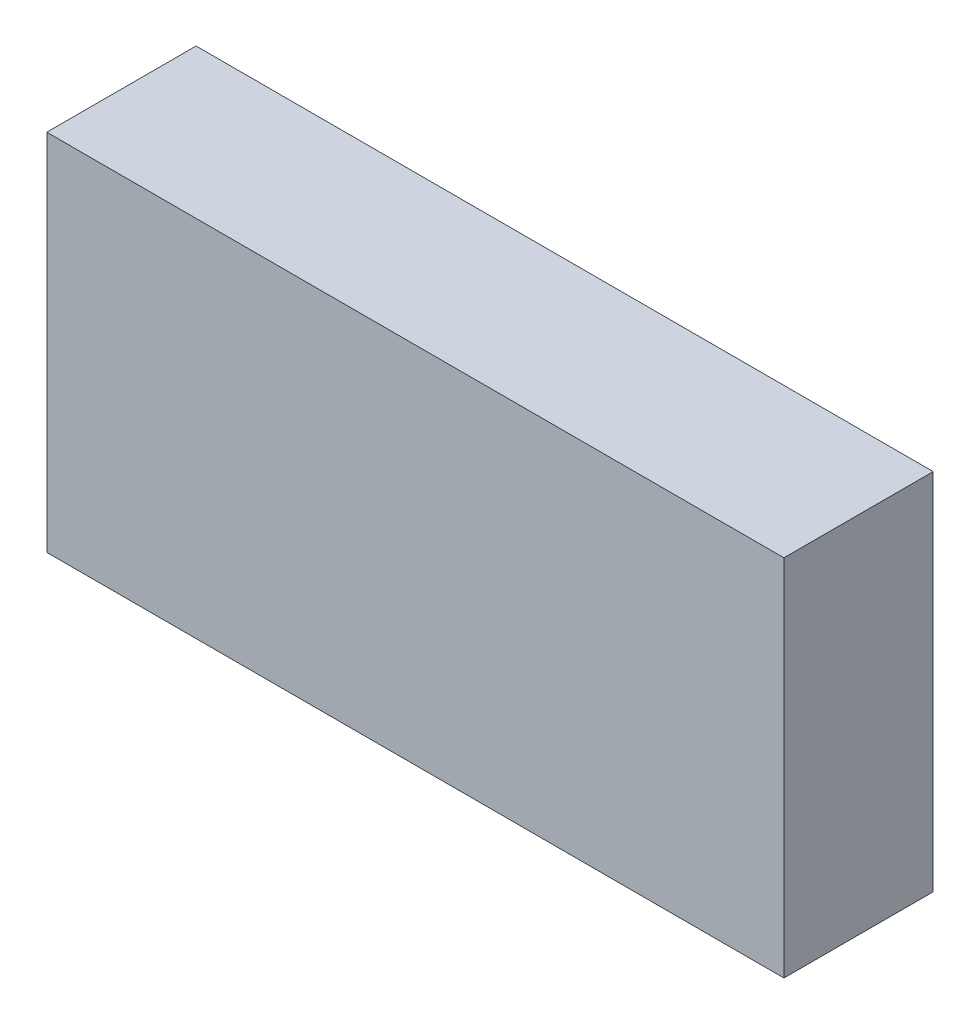
ISO-10303-21;
HEADER;
FILE_DESCRIPTION(('STEP AP214'),'2;1');
FILE_NAME('part.step','',(''),(''),'','','');
FILE_SCHEMA(('AUTOMOTIVE_DESIGN { 1 0 10303 214 1 1 1 1 }'));
ENDSEC;
DATA;
#1=APPLICATION_CONTEXT('core data for automotive mechanical design processes');
#2=APPLICATION_PROTOCOL_DEFINITION('international standard','automotive_design',2000,#1);
#3=PRODUCT_CONTEXT('',#1,'mechanical');
#4=PRODUCT('Part','Part','',(#3));
#5=PRODUCT_RELATED_PRODUCT_CATEGORY('part','',(#4));
#6=PRODUCT_DEFINITION_FORMATION('','',#4);
#7=PRODUCT_DEFINITION_CONTEXT('part definition',#1,'design');
#8=PRODUCT_DEFINITION('design','',#6,#7);
#9=PRODUCT_DEFINITION_SHAPE('','',#8);
#10=(LENGTH_UNIT() NAMED_UNIT(*) SI_UNIT(.MILLI.,.METRE.));
#11=(NAMED_UNIT(*) PLANE_ANGLE_UNIT() SI_UNIT($,.RADIAN.));
#12=(NAMED_UNIT(*) SI_UNIT($,.STERADIAN.) SOLID_ANGLE_UNIT());
#13=UNCERTAINTY_MEASURE_WITH_UNIT(LENGTH_MEASURE(1.E-05),#10,'distance_accuracy_value','');
#14=(GEOMETRIC_REPRESENTATION_CONTEXT(3) GLOBAL_UNCERTAINTY_ASSIGNED_CONTEXT((#13)) GLOBAL_UNIT_ASSIGNED_CONTEXT((#10,
#11,#12)) REPRESENTATION_CONTEXT('',''));
#15=CARTESIAN_POINT('',(0.,0.,0.));
#16=DIRECTION('',(0.,0.,1.));
#17=DIRECTION('',(1.,0.,0.));
#18=AXIS2_PLACEMENT_3D('',#15,#16,#17);
#19=CARTESIAN_POINT('',(7.9,-3.9,3.2));
#20=DIRECTION('',(-1.,0.,0.));
#21=DIRECTION('',(0.,0.,1.));
#22=AXIS2_PLACEMENT_3D('',#19,#20,#21);
#23=PLANE('',#22);
#24=DIRECTION('',(0.,1.,0.));
#25=VECTOR('',#24,1.);
#26=CARTESIAN_POINT('',(7.9,-3.9,0.));
#27=LINE('',#26,#25);
#28=CARTESIAN_POINT('',(7.9,-3.9,0.));
#29=VERTEX_POINT('',#28);
#30=CARTESIAN_POINT('',(7.9,3.9,0.));
#31=VERTEX_POINT('',#30);
#32=EDGE_CURVE('E98',#29,#31,#27,.T.);
#33=ORIENTED_EDGE('',*,*,#32,.T.);
#34=DIRECTION('',(0.,0.,-1.));
#35=VECTOR('',#34,1.);
#36=CARTESIAN_POINT('',(7.9,3.9,3.2));
#37=LINE('',#36,#35);
#38=CARTESIAN_POINT('',(7.9,3.9,3.2));
#39=VERTEX_POINT('',#38);
#40=EDGE_CURVE('E11',#39,#31,#37,.T.);
#41=ORIENTED_EDGE('',*,*,#40,.F.);
#42=DIRECTION('',(0.,1.,0.));
#43=VECTOR('',#42,1.);
#44=CARTESIAN_POINT('',(7.9,-3.9,3.2));
#45=LINE('',#44,#43);
#46=CARTESIAN_POINT('',(7.9,-3.9,3.2));
#47=VERTEX_POINT('',#46);
#48=EDGE_CURVE('E86',#47,#39,#45,.T.);
#49=ORIENTED_EDGE('',*,*,#48,.F.);
#50=DIRECTION('',(0.,0.,-1.));
#51=VECTOR('',#50,1.);
#52=CARTESIAN_POINT('',(7.9,-3.9,3.2));
#53=LINE('',#52,#51);
#54=EDGE_CURVE('E94',#47,#29,#53,.T.);
#55=ORIENTED_EDGE('',*,*,#54,.T.);
#56=EDGE_LOOP('',(#33,#41,#49,#55));
#57=FACE_BOUND('',#56,.T.);
#58=ADVANCED_FACE('F35',(#57),#23,.F.);
#59=CARTESIAN_POINT('',(-7.9,3.9,3.2));
#60=DIRECTION('',(0.,-1.,0.));
#61=DIRECTION('',(0.,0.,-1.));
#62=AXIS2_PLACEMENT_3D('',#59,#60,#61);
#63=PLANE('',#62);
#64=DIRECTION('',(-1.,0.,0.));
#65=VECTOR('',#64,1.);
#66=CARTESIAN_POINT('',(-7.9,3.9,0.));
#67=LINE('',#66,#65);
#68=CARTESIAN_POINT('',(-7.9,3.9,0.));
#69=VERTEX_POINT('',#68);
#70=EDGE_CURVE('E90',#31,#69,#67,.T.);
#71=ORIENTED_EDGE('',*,*,#70,.T.);
#72=DIRECTION('',(0.,0.,-1.));
#73=VECTOR('',#72,1.);
#74=CARTESIAN_POINT('',(-7.9,3.9,3.2));
#75=LINE('',#74,#73);
#76=CARTESIAN_POINT('',(-7.9,3.9,3.2));
#77=VERTEX_POINT('',#76);
#78=EDGE_CURVE('E43',#77,#69,#75,.T.);
#79=ORIENTED_EDGE('',*,*,#78,.F.);
#80=DIRECTION('',(-1.,0.,0.));
#81=VECTOR('',#80,1.);
#82=CARTESIAN_POINT('',(-7.9,3.9,3.2));
#83=LINE('',#82,#81);
#84=EDGE_CURVE('E81',#39,#77,#83,.T.);
#85=ORIENTED_EDGE('',*,*,#84,.F.);
#86=ORIENTED_EDGE('',*,*,#40,.T.);
#87=EDGE_LOOP('',(#71,#79,#85,#86));
#88=FACE_BOUND('',#87,.T.);
#89=ADVANCED_FACE('F89',(#88),#63,.F.);
#90=CARTESIAN_POINT('',(-7.9,-3.9,3.2));
#91=DIRECTION('',(1.,0.,0.));
#92=DIRECTION('',(0.,0.,-1.));
#93=AXIS2_PLACEMENT_3D('',#90,#91,#92);
#94=PLANE('',#93);
#95=DIRECTION('',(0.,-1.,0.));
#96=VECTOR('',#95,1.);
#97=CARTESIAN_POINT('',(-7.9,-3.9,0.));
#98=LINE('',#97,#96);
#99=CARTESIAN_POINT('',(-7.9,-3.9,0.));
#100=VERTEX_POINT('',#99);
#101=EDGE_CURVE('E68',#69,#100,#98,.T.);
#102=ORIENTED_EDGE('',*,*,#101,.T.);
#103=DIRECTION('',(0.,0.,-1.));
#104=VECTOR('',#103,1.);
#105=CARTESIAN_POINT('',(-7.9,-3.9,3.2));
#106=LINE('',#105,#104);
#107=CARTESIAN_POINT('',(-7.9,-3.9,3.2));
#108=VERTEX_POINT('',#107);
#109=EDGE_CURVE('E91',#108,#100,#106,.T.);
#110=ORIENTED_EDGE('',*,*,#109,.F.);
#111=DIRECTION('',(0.,-1.,0.));
#112=VECTOR('',#111,1.);
#113=CARTESIAN_POINT('',(-7.9,-3.9,3.2));
#114=LINE('',#113,#112);
#115=EDGE_CURVE('E84',#77,#108,#114,.T.);
#116=ORIENTED_EDGE('',*,*,#115,.F.);
#117=ORIENTED_EDGE('',*,*,#78,.T.);
#118=EDGE_LOOP('',(#102,#110,#116,#117));
#119=FACE_BOUND('',#118,.T.);
#120=ADVANCED_FACE('F92',(#119),#94,.F.);
#121=CARTESIAN_POINT('',(-7.9,-3.9,3.2));
#122=DIRECTION('',(0.,1.,0.));
#123=DIRECTION('',(0.,0.,1.));
#124=AXIS2_PLACEMENT_3D('',#121,#122,#123);
#125=PLANE('',#124);
#126=DIRECTION('',(1.,0.,0.));
#127=VECTOR('',#126,1.);
#128=CARTESIAN_POINT('',(-7.9,-3.9,0.));
#129=LINE('',#128,#127);
#130=EDGE_CURVE('E74',#100,#29,#129,.T.);
#131=ORIENTED_EDGE('',*,*,#130,.T.);
#132=ORIENTED_EDGE('',*,*,#54,.F.);
#133=DIRECTION('',(1.,0.,0.));
#134=VECTOR('',#133,1.);
#135=CARTESIAN_POINT('',(-7.9,-3.9,3.2));
#136=LINE('',#135,#134);
#137=EDGE_CURVE('E51',#108,#47,#136,.T.);
#138=ORIENTED_EDGE('',*,*,#137,.F.);
#139=ORIENTED_EDGE('',*,*,#109,.T.);
#140=EDGE_LOOP('',(#131,#132,#138,#139));
#141=FACE_BOUND('',#140,.T.);
#142=ADVANCED_FACE('F106',(#141),#125,.F.);
#143=CARTESIAN_POINT('',(0.,0.,3.2));
#144=DIRECTION('',(0.,0.,-1.));
#145=DIRECTION('',(-1.,0.,0.));
#146=AXIS2_PLACEMENT_3D('',#143,#144,#145);
#147=PLANE('',#146);
#148=ORIENTED_EDGE('',*,*,#48,.T.);
#149=ORIENTED_EDGE('',*,*,#84,.T.);
#150=ORIENTED_EDGE('',*,*,#115,.T.);
#151=ORIENTED_EDGE('',*,*,#137,.T.);
#152=EDGE_LOOP('',(#148,#149,#150,#151));
#153=FACE_BOUND('',#152,.T.);
#154=ADVANCED_FACE('F82',(#153),#147,.F.);
#155=CARTESIAN_POINT('',(0.,0.,0.));
#156=DIRECTION('',(0.,0.,-1.));
#157=DIRECTION('',(-1.,0.,0.));
#158=AXIS2_PLACEMENT_3D('',#155,#156,#157);
#159=PLANE('',#158);
#160=CARTESIAN_POINT('',(-4.,0.,0.));
#161=DIRECTION('',(0.,0.,-1.));
#162=DIRECTION('',(-1.,0.,0.));
#163=AXIS2_PLACEMENT_3D('',#160,#161,#162);
#164=CIRCLE('',#163,2.5);
#165=CARTESIAN_POINT('',(-6.5,0.,0.));
#166=VERTEX_POINT('',#165);
#167=EDGE_CURVE('E118',#166,#166,#164,.T.);
#168=ORIENTED_EDGE('',*,*,#167,.F.);
#169=EDGE_LOOP('',(#168));
#170=FACE_BOUND('',#169,.T.);
#171=CARTESIAN_POINT('',(4.,0.,0.));
#172=DIRECTION('',(0.,0.,-1.));
#173=DIRECTION('',(-1.,0.,0.));
#174=AXIS2_PLACEMENT_3D('',#171,#172,#173);
#175=CIRCLE('',#174,2.5);
#176=CARTESIAN_POINT('',(1.5,0.,0.));
#177=VERTEX_POINT('',#176);
#178=EDGE_CURVE('E112',#177,#177,#175,.T.);
#179=ORIENTED_EDGE('',*,*,#178,.F.);
#180=EDGE_LOOP('',(#179));
#181=FACE_BOUND('',#180,.T.);
#182=ORIENTED_EDGE('',*,*,#32,.F.);
#183=ORIENTED_EDGE('',*,*,#130,.F.);
#184=ORIENTED_EDGE('',*,*,#101,.F.);
#185=ORIENTED_EDGE('',*,*,#70,.F.);
#186=EDGE_LOOP('',(#182,#183,#184,#185));
#187=FACE_BOUND('',#186,.T.);
#188=ADVANCED_FACE('F109',(#170,#181,#187),#159,.T.);
#189=CARTESIAN_POINT('',(4.,0.,1.8));
#190=DIRECTION('',(0.,0.,-1.));
#191=DIRECTION('',(-1.,0.,0.));
#192=AXIS2_PLACEMENT_3D('',#189,#190,#191);
#193=CYLINDRICAL_SURFACE('',#192,2.5);
#194=CARTESIAN_POINT('',(4.,0.,1.8));
#195=DIRECTION('',(0.,0.,-1.));
#196=DIRECTION('',(-1.,0.,0.));
#197=AXIS2_PLACEMENT_3D('',#194,#195,#196);
#198=CIRCLE('',#197,2.5);
#199=CARTESIAN_POINT('',(1.5,0.,1.8));
#200=VERTEX_POINT('',#199);
#201=EDGE_CURVE('E101',#200,#200,#198,.T.);
#202=ORIENTED_EDGE('',*,*,#201,.F.);
#203=EDGE_LOOP('',(#202));
#204=FACE_BOUND('',#203,.T.);
#205=ORIENTED_EDGE('',*,*,#178,.T.);
#206=EDGE_LOOP('',(#205));
#207=FACE_BOUND('',#206,.T.);
#208=ADVANCED_FACE('F135',(#204,#207),#193,.F.);
#209=CARTESIAN_POINT('',(4.,0.,1.8));
#210=DIRECTION('',(0.,0.,-1.));
#211=DIRECTION('',(-1.,0.,0.));
#212=AXIS2_PLACEMENT_3D('',#209,#210,#211);
#213=PLANE('',#212);
#214=ORIENTED_EDGE('',*,*,#201,.T.);
#215=EDGE_LOOP('',(#214));
#216=FACE_BOUND('',#215,.T.);
#217=ADVANCED_FACE('F129',(#216),#213,.T.);
#218=CARTESIAN_POINT('',(-4.,0.,1.8));
#219=DIRECTION('',(0.,0.,-1.));
#220=DIRECTION('',(-1.,0.,0.));
#221=AXIS2_PLACEMENT_3D('',#218,#219,#220);
#222=CYLINDRICAL_SURFACE('',#221,2.5);
#223=CARTESIAN_POINT('',(-4.,0.,1.8));
#224=DIRECTION('',(0.,0.,-1.));
#225=DIRECTION('',(-1.,0.,0.));
#226=AXIS2_PLACEMENT_3D('',#223,#224,#225);
#227=CIRCLE('',#226,2.5);
#228=CARTESIAN_POINT('',(-6.5,0.,1.8));
#229=VERTEX_POINT('',#228);
#230=EDGE_CURVE('E115',#229,#229,#227,.T.);
#231=ORIENTED_EDGE('',*,*,#230,.F.);
#232=EDGE_LOOP('',(#231));
#233=FACE_BOUND('',#232,.T.);
#234=ORIENTED_EDGE('',*,*,#167,.T.);
#235=EDGE_LOOP('',(#234));
#236=FACE_BOUND('',#235,.T.);
#237=ADVANCED_FACE('F126',(#233,#236),#222,.F.);
#238=CARTESIAN_POINT('',(-4.,0.,1.8));
#239=DIRECTION('',(0.,0.,-1.));
#240=DIRECTION('',(-1.,0.,0.));
#241=AXIS2_PLACEMENT_3D('',#238,#239,#240);
#242=PLANE('',#241);
#243=ORIENTED_EDGE('',*,*,#230,.T.);
#244=EDGE_LOOP('',(#243));
#245=FACE_BOUND('',#244,.T.);
#246=ADVANCED_FACE('F124',(#245),#242,.T.);
#247=CLOSED_SHELL('',(#58,#89,#120,#142,#154,#188,#208,#217,#237,#246));
#248=MANIFOLD_SOLID_BREP('B2',#247);
#249=ADVANCED_BREP_SHAPE_REPRESENTATION('',(#18,#248),#14);
#250=SHAPE_DEFINITION_REPRESENTATION(#9,#249);
ENDSEC;
END-ISO-10303-21;
